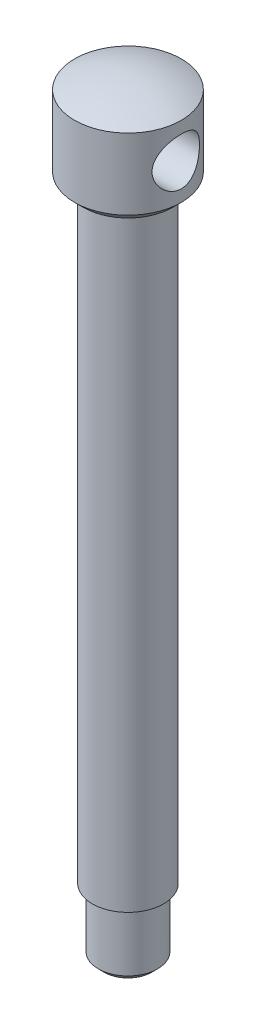
ISO-10303-21;
HEADER;
FILE_DESCRIPTION(('STEP AP214'),'2;1');
FILE_NAME('part.step','',(''),(''),'','','');
FILE_SCHEMA(('AUTOMOTIVE_DESIGN { 1 0 10303 214 1 1 1 1 }'));
ENDSEC;
DATA;
#1=APPLICATION_CONTEXT('core data for automotive mechanical design processes');
#2=APPLICATION_PROTOCOL_DEFINITION('international standard','automotive_design',2000,#1);
#3=PRODUCT_CONTEXT('',#1,'mechanical');
#4=PRODUCT('Part','Part','',(#3));
#5=PRODUCT_RELATED_PRODUCT_CATEGORY('part','',(#4));
#6=PRODUCT_DEFINITION_FORMATION('','',#4);
#7=PRODUCT_DEFINITION_CONTEXT('part definition',#1,'design');
#8=PRODUCT_DEFINITION('design','',#6,#7);
#9=PRODUCT_DEFINITION_SHAPE('','',#8);
#10=(LENGTH_UNIT() NAMED_UNIT(*) SI_UNIT(.MILLI.,.METRE.));
#11=(NAMED_UNIT(*) PLANE_ANGLE_UNIT() SI_UNIT($,.RADIAN.));
#12=(NAMED_UNIT(*) SI_UNIT($,.STERADIAN.) SOLID_ANGLE_UNIT());
#13=UNCERTAINTY_MEASURE_WITH_UNIT(LENGTH_MEASURE(1.E-05),#10,'distance_accuracy_value','');
#14=(GEOMETRIC_REPRESENTATION_CONTEXT(3) GLOBAL_UNCERTAINTY_ASSIGNED_CONTEXT((#13)) GLOBAL_UNIT_ASSIGNED_CONTEXT((#10,
#11,#12)) REPRESENTATION_CONTEXT('',''));
#15=CARTESIAN_POINT('',(0.,0.,0.));
#16=DIRECTION('',(0.,0.,1.));
#17=DIRECTION('',(1.,0.,0.));
#18=AXIS2_PLACEMENT_3D('',#15,#16,#17);
#19=CARTESIAN_POINT('',(0.,24.,0.));
#20=DIRECTION('',(0.,-1.,0.));
#21=DIRECTION('',(0.,0.,-1.));
#22=AXIS2_PLACEMENT_3D('',#19,#20,#21);
#23=CYLINDRICAL_SURFACE('',#22,18.);
#24=CARTESIAN_POINT('',(0.,24.,0.));
#25=DIRECTION('',(0.,1.,0.));
#26=DIRECTION('',(0.,0.,1.));
#27=AXIS2_PLACEMENT_3D('',#24,#25,#26);
#28=CIRCLE('',#27,18.);
#29=CARTESIAN_POINT('',(0.,24.,18.));
#30=VERTEX_POINT('',#29);
#31=EDGE_CURVE('E53',#30,#30,#28,.T.);
#32=ORIENTED_EDGE('',*,*,#31,.F.);
#33=EDGE_LOOP('',(#32));
#34=FACE_BOUND('',#33,.T.);
#35=CARTESIAN_POINT('',(0.,0.,0.));
#36=DIRECTION('',(0.,1.,0.));
#37=DIRECTION('',(0.,0.,1.));
#38=AXIS2_PLACEMENT_3D('',#35,#36,#37);
#39=CIRCLE('',#38,18.);
#40=CARTESIAN_POINT('',(0.,0.,18.));
#41=VERTEX_POINT('',#40);
#42=EDGE_CURVE('E84',#41,#41,#39,.T.);
#43=ORIENTED_EDGE('',*,*,#42,.T.);
#44=EDGE_LOOP('',(#43));
#45=FACE_BOUND('',#44,.T.);
#46=CARTESIAN_POINT('',(-16.1245154965971,12.,8.));
#47=CARTESIAN_POINT('',(-16.1245173844685,12.2119145699032,7.99999831723584));
#48=CARTESIAN_POINT('',(-16.1287075710206,12.4238870824603,7.99156779414506));
#49=CARTESIAN_POINT('',(-16.1453266061845,12.8462633434164,7.95793746262861));
#50=CARTESIAN_POINT('',(-16.1577603573088,13.0566660829166,7.93272767540808));
#51=CARTESIAN_POINT('',(-16.1904617266022,13.4746324276211,7.86576997483584));
#52=CARTESIAN_POINT('',(-16.2107447194581,13.6821896277852,7.82398959985824));
#53=CARTESIAN_POINT('',(-16.2584620085057,14.0926462027807,7.72434196550041));
#54=CARTESIAN_POINT('',(-16.2858993425086,14.2955435590751,7.66646787185647));
#55=CARTESIAN_POINT('',(-16.3468833814742,14.6942970350349,7.53555475293443));
#56=CARTESIAN_POINT('',(-16.3803993264153,14.8901829160202,7.46259183317014));
#57=CARTESIAN_POINT('',(-16.4526380017907,15.2749075296295,7.30194878977129));
#58=CARTESIAN_POINT('',(-16.491362725522,15.4637435288845,7.21426302879007));
#59=CARTESIAN_POINT('',(-16.5728994701461,15.833203404339,7.02492815140359));
#60=CARTESIAN_POINT('',(-16.6157090671748,16.01383205779,6.92328730008513));
#61=CARTESIAN_POINT('',(-16.7043290743674,16.3662002668038,6.70664513728595));
#62=CARTESIAN_POINT('',(-16.7501405774116,16.5379365437966,6.59163894807261));
#63=CARTESIAN_POINT('',(-16.8466296186917,16.882417707415,6.34115277263391));
#64=CARTESIAN_POINT('',(-16.8974306119768,17.0545169166474,6.20483168139261));
#65=CARTESIAN_POINT('',(-16.9997880262405,17.3868159200026,5.91864012310987));
#66=CARTESIAN_POINT('',(-17.0513444742763,17.5470152866687,5.76876916976921));
#67=CARTESIAN_POINT('',(-17.1539222783134,17.8547509634068,5.45619080306819));
#68=CARTESIAN_POINT('',(-17.2049433056521,18.0022798541583,5.2934759744243));
#69=CARTESIAN_POINT('',(-17.3051194894044,18.2836647216014,4.9561857705587));
#70=CARTESIAN_POINT('',(-17.3542752786211,18.4175253619383,4.78161447487838));
#71=CARTESIAN_POINT('',(-17.451944420544,18.6772432950865,4.4122508569734));
#72=CARTESIAN_POINT('',(-17.5002965309104,18.8023418576139,4.21688105837181));
#73=CARTESIAN_POINT('',(-17.592223783187,19.0354680122102,3.81524307030924));
#74=CARTESIAN_POINT('',(-17.6358009081066,19.1435026990481,3.60897945809888));
#75=CARTESIAN_POINT('',(-17.7169432898632,19.3415420816456,3.18686322089285));
#76=CARTESIAN_POINT('',(-17.7545095070744,19.4315496582107,2.97101213476107));
#77=CARTESIAN_POINT('',(-17.8225194812956,19.5925972938844,2.53126088316878));
#78=CARTESIAN_POINT('',(-17.852963815067,19.6636388890074,2.30736137120063));
#79=CARTESIAN_POINT('',(-17.904257876405,19.782361040496,1.86651849716053));
#80=CARTESIAN_POINT('',(-17.9255631028507,19.8311611107898,1.6499293680169));
#81=CARTESIAN_POINT('',(-17.9604311199582,19.9106488664382,1.21283479296799));
#82=CARTESIAN_POINT('',(-17.9739941859878,19.9413371959804,0.992329486638333));
#83=CARTESIAN_POINT('',(-17.9929834790412,19.9842234642036,0.549266332095985));
#84=CARTESIAN_POINT('',(-17.9984129168231,19.9964286991262,0.326709328719163));
#85=CARTESIAN_POINT('',(-18.000986079252,20.0022189961761,-0.118690285937499));
#86=CARTESIAN_POINT('',(-17.9981301795248,19.9958049024332,-0.341532883811738));
#87=CARTESIAN_POINT('',(-17.9847020933519,19.9655302708869,-0.770229836855619));
#88=CARTESIAN_POINT('',(-17.9746788214889,19.9429106160868,-0.976190488290877));
#89=CARTESIAN_POINT('',(-17.9477796781798,19.8818492449923,-1.38537156736781));
#90=CARTESIAN_POINT('',(-17.9309014453193,19.8434020763335,-1.58859102576598));
#91=CARTESIAN_POINT('',(-17.8907148831089,19.7510904248939,-1.99076696624121));
#92=CARTESIAN_POINT('',(-17.8674087504012,19.6972312087224,-2.18972487965375));
#93=CARTESIAN_POINT('',(-17.814913874302,19.574577717923,-2.58226130183553));
#94=CARTESIAN_POINT('',(-17.7857228880376,19.5057777482051,-2.77583772747246));
#95=CARTESIAN_POINT('',(-17.7216726940735,19.3527262826544,-3.15921637846952));
#96=CARTESIAN_POINT('',(-17.6867358849264,19.2682608788418,-3.34892013533131));
#97=CARTESIAN_POINT('',(-17.612310171007,19.0852283296333,-3.72054572501928));
#98=CARTESIAN_POINT('',(-17.5728196098477,18.9866560498229,-3.90246469299827));
#99=CARTESIAN_POINT('',(-17.4901925625269,18.7761497176617,-4.25750941286914));
#100=CARTESIAN_POINT('',(-17.447056279086,18.6642164081091,-4.43063565282522));
#101=CARTESIAN_POINT('',(-17.3580761944569,18.4276607109613,-4.76733985854246));
#102=CARTESIAN_POINT('',(-17.3122314231476,18.3030337650693,-4.93091436085488));
#103=CARTESIAN_POINT('',(-17.2151845254857,18.0315737962729,-5.26014620577745));
#104=CARTESIAN_POINT('',(-17.1638442956857,17.8837656621301,-5.4249598087832));
#105=CARTESIAN_POINT('',(-17.0605056347139,17.575122947009,-5.74168121901704));
#106=CARTESIAN_POINT('',(-17.0085071780705,17.4142878606156,-5.89358852504236));
#107=CARTESIAN_POINT('',(-16.9051693940131,17.0803516529326,-6.18376803613575));
#108=CARTESIAN_POINT('',(-16.8538305336574,16.9072423508915,-6.32203099763521));
#109=CARTESIAN_POINT('',(-16.753252225237,16.5498191149581,-6.58393616631743));
#110=CARTESIAN_POINT('',(-16.7040120270665,16.3655092425015,-6.70758362588862));
#111=CARTESIAN_POINT('',(-16.6070020506593,15.9785735644356,-6.94438947774858));
#112=CARTESIAN_POINT('',(-16.5593822210479,15.7755029510885,-7.05688426159653));
#113=CARTESIAN_POINT('',(-16.4695129333972,15.3594753344981,-7.26415218409369));
#114=CARTESIAN_POINT('',(-16.4272611000893,15.1465227612432,-7.3589331696747));
#115=CARTESIAN_POINT('',(-16.3496213055803,14.7121477583196,-7.52985387823975));
#116=CARTESIAN_POINT('',(-16.3142303541259,14.4907290691367,-7.60600172612036));
#117=CARTESIAN_POINT('',(-16.2516495386502,14.0409961199143,-7.73881716542491));
#118=CARTESIAN_POINT('',(-16.2244588203143,13.8126825809209,-7.79548678621097));
#119=CARTESIAN_POINT('',(-16.1809822825699,13.3673921967089,-7.88531040967217));
#120=CARTESIAN_POINT('',(-16.1640613735819,13.1507551466112,-7.91984376057651));
#121=CARTESIAN_POINT('',(-16.1388886731971,12.7148765749734,-7.97101582222543));
#122=CARTESIAN_POINT('',(-16.130636464286,12.4956351793819,-7.98765539479638));
#123=CARTESIAN_POINT('',(-16.1231199685624,12.0564554242867,-8.00281664233786));
#124=CARTESIAN_POINT('',(-16.1238523193879,11.8365173563091,-8.00134509517347));
#125=CARTESIAN_POINT('',(-16.134268851521,11.3977271592388,-7.98031997885346));
#126=CARTESIAN_POINT('',(-16.1439526799922,11.1788749876856,-7.96076712240067));
#127=CARTESIAN_POINT('',(-16.1708129564299,10.7609413125311,-7.90605141179141));
#128=CARTESIAN_POINT('',(-16.1873501344573,10.5616427376195,-7.87221665979632));
#129=CARTESIAN_POINT('',(-16.2272043533718,10.1667609179082,-7.78973268777251));
#130=CARTESIAN_POINT('',(-16.2505237032065,9.97117896260591,-7.74107842226681));
#131=CARTESIAN_POINT('',(-16.3032361956667,9.58502946303924,-7.62943609248794));
#132=CARTESIAN_POINT('',(-16.3326282043979,9.39446099012929,-7.56645070391758));
#133=CARTESIAN_POINT('',(-16.396652000303,9.01932537614815,-7.42668830283406));
#134=CARTESIAN_POINT('',(-16.4312858447315,8.83476062605354,-7.34990587319376));
#135=CARTESIAN_POINT('',(-16.5449440183094,8.27548917084069,-7.09233057162595));
#136=CARTESIAN_POINT('',(-16.6312839817267,7.91227349797858,-6.88923170163483));
#137=CARTESIAN_POINT('',(-16.8138795280454,7.22324893180042,-6.43071715646188));
#138=CARTESIAN_POINT('',(-16.9101397650623,6.89745774921686,-6.17527686915352));
#139=CARTESIAN_POINT('',(-17.0597302595375,6.42691182824524,-5.74384979288593));
#140=CARTESIAN_POINT('',(-17.1128010645076,6.2668825004083,-5.58412874072951));
#141=CARTESIAN_POINT('',(-17.2177753192135,5.96075686812445,-5.25153114631175));
#142=CARTESIAN_POINT('',(-17.2696791438604,5.81465603860062,-5.07865890963662));
#143=CARTESIAN_POINT('',(-17.3709727481302,5.53723092057165,-4.72058782341959));
#144=CARTESIAN_POINT('',(-17.4203610743079,5.40591512292914,-4.53538198701895));
#145=CARTESIAN_POINT('',(-17.5152557653374,5.15915562653861,-4.15384559946254));
#146=CARTESIAN_POINT('',(-17.5607638077543,5.04370505542867,-3.95751991748039));
#147=CARTESIAN_POINT('',(-17.6470640049451,4.82862209606487,-3.55306354214972));
#148=CARTESIAN_POINT('',(-17.6878108023972,4.72913892683237,-3.34484366457995));
#149=CARTESIAN_POINT('',(-17.7629557505932,4.54819659982386,-2.91959172938723));
#150=CARTESIAN_POINT('',(-17.7973537914545,4.46673775400314,-2.7025595193221));
#151=CARTESIAN_POINT('',(-17.8587679278129,4.32277191975555,-2.26140906177526));
#152=CARTESIAN_POINT('',(-17.8857881728829,4.2602542758474,-2.03729487695818));
#153=CARTESIAN_POINT('',(-17.9316455780454,4.1548632895351,-1.58367729933312));
#154=CARTESIAN_POINT('',(-17.9504834603661,4.11198821333248,-1.354174384055));
#155=CARTESIAN_POINT('',(-17.9782671297193,4.04897376655184,-0.909716399150556));
#156=CARTESIAN_POINT('',(-17.9878671551004,4.02732817564721,-0.695014576236323));
#157=CARTESIAN_POINT('',(-17.9993471860939,4.00146034748862,-0.264362285110343));
#158=CARTESIAN_POINT('',(-18.0012276120922,3.99723716146344,-0.0484118855336484));
#159=CARTESIAN_POINT('',(-17.997217448135,4.00626176004555,0.383006037482065));
#160=CARTESIAN_POINT('',(-17.9913283745967,4.0195061354099,0.59847364692893));
#161=CARTESIAN_POINT('',(-17.971942933447,4.06330557092701,1.02729288739305));
#162=CARTESIAN_POINT('',(-17.9584466541185,4.09386043018835,1.24064454293712));
#163=CARTESIAN_POINT('',(-17.9249777004703,4.17018880765659,1.65416895049555));
#164=CARTESIAN_POINT('',(-17.9053211453748,4.21522180045514,1.85450476600019));
#165=CARTESIAN_POINT('',(-17.8598656381032,4.32034850891315,2.25054265745567));
#166=CARTESIAN_POINT('',(-17.8340645509163,4.38044745985083,2.44624309673059));
#167=CARTESIAN_POINT('',(-17.7769360415322,4.51513718601026,2.83169559318192));
#168=CARTESIAN_POINT('',(-17.7456100149699,4.58972430191025,3.02144913835909));
#169=CARTESIAN_POINT('',(-17.678127350379,4.75281449472967,3.39406573427307));
#170=CARTESIAN_POINT('',(-17.6419688702804,4.84132288054765,3.57692612317894));
#171=CARTESIAN_POINT('',(-17.5638914957692,5.03590756725889,3.94287872867609));
#172=CARTESIAN_POINT('',(-17.5217854585831,5.14259959262605,4.12560358359436));
#173=CARTESIAN_POINT('',(-17.4341502103175,5.36972312448721,4.48151913664302));
#174=CARTESIAN_POINT('',(-17.3886198254664,5.49015934949821,4.6547065300352));
#175=CARTESIAN_POINT('',(-17.2951906704745,5.74399909977319,4.99067005689803));
#176=CARTESIAN_POINT('',(-17.2472914674081,5.87740499971223,5.15344427469433));
#177=CARTESIAN_POINT('',(-17.1502306027945,6.1564124607654,5.46778331119966));
#178=CARTESIAN_POINT('',(-17.1010688746332,6.30201466630886,5.61934753679651));
#179=CARTESIAN_POINT('',(-16.9987278379694,6.61663778858496,5.92205669373057));
#180=CARTESIAN_POINT('',(-16.9455381412313,6.78660009988145,6.07222140456486));
#181=CARTESIAN_POINT('',(-16.8405029326141,7.1388492179371,6.35771940607388));
#182=CARTESIAN_POINT('',(-16.7886570027711,7.3211321272898,6.49305735176128));
#183=CARTESIAN_POINT('',(-16.6877339704444,7.69728935827532,6.74821326098058));
#184=CARTESIAN_POINT('',(-16.63865988301,7.89117584697097,6.86801450136303));
#185=CARTESIAN_POINT('',(-16.5448700115573,8.28919140732939,7.09097341812934));
#186=CARTESIAN_POINT('',(-16.5001522654361,8.4933158044783,7.19413860126822));
#187=CARTESIAN_POINT('',(-16.4163378623127,8.91158578597332,7.38340158764196));
#188=CARTESIAN_POINT('',(-16.3772670113222,9.12577179511081,7.46942167707747));
#189=CARTESIAN_POINT('',(-16.3064029483656,9.56176342387312,7.62288490526618));
#190=CARTESIAN_POINT('',(-16.2746060925309,9.78356516410991,7.69033734883932));
#191=CARTESIAN_POINT('',(-16.219563234548,10.2325873729558,7.80575763461412));
#192=CARTESIAN_POINT('',(-16.1962948027815,10.4597919297211,7.85377662169272));
#193=CARTESIAN_POINT('',(-16.1591558445265,10.9181503540471,7.92991158533124));
#194=CARTESIAN_POINT('',(-16.1452782569039,11.1493011200017,7.95804251676984));
#195=CARTESIAN_POINT('',(-16.132434322231,11.4842084955691,7.98402286016531));
#196=CARTESIAN_POINT('',(-16.1294677679271,11.5872461230906,7.99001178153472));
#197=CARTESIAN_POINT('',(-16.1255078681798,11.7935179120941,7.99800081602834));
#198=CARTESIAN_POINT('',(-16.1245145767981,11.896752078883,8.00000081986765));
#199=CARTESIAN_POINT('',(-16.1245154965971,12.,8.));
#200=B_SPLINE_CURVE_WITH_KNOTS('',3,(#46,#47,#48,#49,#50,#51,#52,#53,#54,#55,#56,#57,#58,#59,
#60,#61,#62,#63,#64,#65,#66,#67,#68,#69,#70,#71,#72,#73,#74,#75,#76,#77,#78,#79,#80,#81,#82,#83,
#84,#85,#86,#87,#88,#89,#90,#91,#92,#93,#94,#95,#96,#97,#98,#99,#100,#101,#102,#103,#104,#105,
#106,#107,#108,#109,#110,#111,#112,#113,#114,#115,#116,#117,#118,#119,#120,#121,#122,#123,#124,
#125,#126,#127,#128,#129,#130,#131,#132,#133,#134,#135,#136,#137,#138,#139,#140,#141,#142,#143,
#144,#145,#146,#147,#148,#149,#150,#151,#152,#153,#154,#155,#156,#157,#158,#159,#160,#161,#162,
#163,#164,#165,#166,#167,#168,#169,#170,#171,#172,#173,#174,#175,#176,#177,#178,#179,#180,#181,
#182,#183,#184,#185,#186,#187,#188,#189,#190,#191,#192,#193,#194,#195,#196,#197,#198,#199),
.UNSPECIFIED.,.T.,.F.,(4,2,2,2,2,2,2,2,2,2,2,2,2,2,2,2,2,2,2,2,2,2,2,2,2,2,2,2,2,2,2,2,2,2,2,2,
2,2,2,2,2,2,2,2,2,2,2,2,2,2,2,2,2,2,2,2,2,2,2,2,2,2,2,2,2,2,2,2,2,2,2,2,2,2,2,2,4),(0.,
0.635636786928929,1.27165193153098,1.90891922718068,2.54645755535102,3.18085542165324,
3.8154967539086,4.44976381995587,5.08426309551977,5.75957539492706,6.43491194065524,
7.1106412777736,7.78613927824711,8.49616211017143,9.20588894929659,9.91550228053243,
10.6250581242452,11.2932925940023,11.9615032949632,12.6294501494797,13.2973667222889,
13.9189587631528,14.5407651134849,15.1623592331946,15.7841907082495,16.4152389805999,
17.0465175195699,17.6777609793301,18.3092319238108,18.9902534133529,19.6713013375874,
20.3528075255057,21.0340680503805,21.7441029457321,22.4538225574607,23.1632321454316,
23.8725678003063,24.5317508363103,25.1909021223531,25.8498067365912,26.5086853801897,
27.1164695431674,27.7244608651212,28.332338764623,28.9404558585894,30.2098823122136,
31.4799070545452,32.1759540258526,32.8717740899456,33.5679917384279,34.2639068482617,
34.9659880424643,35.6680813869599,36.3697790283171,37.0714147207057,37.718598553561,
38.3657471422866,39.0127694420453,39.6597842331429,40.2779063013466,40.8962434595929,
41.514424645059,42.1328421490507,42.7793728810372,43.4261262448349,44.0729982493803,
44.7199044549849,45.4179476734237,46.1157711022534,46.8143395168877,47.5125918262566,
48.2139405270058,48.9149371177799,49.6140766404868,50.3126898825115,50.6223730671826,
50.9320647361692),.UNSPECIFIED.);
#201=CARTESIAN_POINT('',(-16.1245154965971,12.,8.));
#202=VERTEX_POINT('',#201);
#203=EDGE_CURVE('E87',#202,#202,#200,.T.);
#204=ORIENTED_EDGE('',*,*,#203,.F.);
#205=EDGE_LOOP('',(#204));
#206=FACE_BOUND('',#205,.T.);
#207=CARTESIAN_POINT('',(16.1245154965971,12.,8.));
#208=CARTESIAN_POINT('',(16.1245173844685,11.7880854300968,7.99999831723584));
#209=CARTESIAN_POINT('',(16.1287075710206,11.5761129175398,7.99156779414506));
#210=CARTESIAN_POINT('',(16.1453266061845,11.1537366565836,7.95793746262861));
#211=CARTESIAN_POINT('',(16.1577603573088,10.9433339170834,7.93272767540808));
#212=CARTESIAN_POINT('',(16.1904617266022,10.5253675723789,7.86576997483584));
#213=CARTESIAN_POINT('',(16.2107447194581,10.3178103722148,7.82398959985824));
#214=CARTESIAN_POINT('',(16.2584620085057,9.90735379721933,7.72434196550041));
#215=CARTESIAN_POINT('',(16.2858993425086,9.70445644092491,7.66646787185647));
#216=CARTESIAN_POINT('',(16.3468833814742,9.3057029649651,7.53555475293443));
#217=CARTESIAN_POINT('',(16.3803993264153,9.10981708397977,7.46259183317014));
#218=CARTESIAN_POINT('',(16.4526380017907,8.72509247037046,7.30194878977129));
#219=CARTESIAN_POINT('',(16.491362725522,8.53625647111554,7.21426302879007));
#220=CARTESIAN_POINT('',(16.5728994701461,8.16679659566098,7.02492815140359));
#221=CARTESIAN_POINT('',(16.6157090671748,7.98616794221004,6.92328730008513));
#222=CARTESIAN_POINT('',(16.7043290743674,7.63379973319621,6.70664513728595));
#223=CARTESIAN_POINT('',(16.7501405774116,7.46206345620336,6.59163894807261));
#224=CARTESIAN_POINT('',(16.8466296186917,7.11758229258499,6.34115277263391));
#225=CARTESIAN_POINT('',(16.8974306119768,6.94548308335264,6.20483168139261));
#226=CARTESIAN_POINT('',(16.9997880262405,6.61318407999737,5.91864012310987));
#227=CARTESIAN_POINT('',(17.0513444742763,6.45298471333128,5.7687691697692));
#228=CARTESIAN_POINT('',(17.1539222783134,6.14524903659325,5.45619080306819));
#229=CARTESIAN_POINT('',(17.2049433056521,5.99772014584169,5.2934759744243));
#230=CARTESIAN_POINT('',(17.3051194894044,5.71633527839862,4.9561857705587));
#231=CARTESIAN_POINT('',(17.3542752786211,5.58247463806171,4.78161447487838));
#232=CARTESIAN_POINT('',(17.451944420544,5.32275670491353,4.4122508569734));
#233=CARTESIAN_POINT('',(17.5002965309104,5.19765814238606,4.21688105837181));
#234=CARTESIAN_POINT('',(17.592223783187,4.9645319877898,3.81524307030923));
#235=CARTESIAN_POINT('',(17.6358009081066,4.85649730095189,3.60897945809888));
#236=CARTESIAN_POINT('',(17.7169432898632,4.6584579183544,3.18686322089284));
#237=CARTESIAN_POINT('',(17.7545095070744,4.56845034178927,2.97101213476107));
#238=CARTESIAN_POINT('',(17.8225194812956,4.40740270611563,2.53126088316878));
#239=CARTESIAN_POINT('',(17.852963815067,4.33636111099256,2.30736137120062));
#240=CARTESIAN_POINT('',(17.904257876405,4.21763895950403,1.86651849716053));
#241=CARTESIAN_POINT('',(17.9255631028507,4.16883888921021,1.6499293680169));
#242=CARTESIAN_POINT('',(17.9604311199582,4.08935113356176,1.21283479296799));
#243=CARTESIAN_POINT('',(17.9739941859878,4.05866280401959,0.992329486638333));
#244=CARTESIAN_POINT('',(17.9929834790412,4.01577653579641,0.549266332095984));
#245=CARTESIAN_POINT('',(17.9984129168231,4.00357130087376,0.326709328719163));
#246=CARTESIAN_POINT('',(18.000986079252,3.99778100382386,-0.118690285937499));
#247=CARTESIAN_POINT('',(17.9981301795248,4.00419509756678,-0.341532883811738));
#248=CARTESIAN_POINT('',(17.9847020933519,4.03446972911309,-0.77022983685562));
#249=CARTESIAN_POINT('',(17.9746788214889,4.05708938391318,-0.976190488290878));
#250=CARTESIAN_POINT('',(17.9477796781798,4.11815075500771,-1.38537156736781));
#251=CARTESIAN_POINT('',(17.9309014453193,4.15659792366646,-1.58859102576598));
#252=CARTESIAN_POINT('',(17.8907148831089,4.24890957510613,-1.99076696624121));
#253=CARTESIAN_POINT('',(17.8674087504012,4.30276879127764,-2.18972487965375));
#254=CARTESIAN_POINT('',(17.814913874302,4.42542228207703,-2.58226130183553));
#255=CARTESIAN_POINT('',(17.7857228880376,4.49422225179495,-2.77583772747246));
#256=CARTESIAN_POINT('',(17.7216726940735,4.64727371734559,-3.15921637846952));
#257=CARTESIAN_POINT('',(17.6867358849264,4.73173912115816,-3.34892013533131));
#258=CARTESIAN_POINT('',(17.612310171007,4.91477167036674,-3.72054572501928));
#259=CARTESIAN_POINT('',(17.5728196098477,5.01334395017711,-3.90246469299827));
#260=CARTESIAN_POINT('',(17.4901925625269,5.2238502823383,-4.25750941286914));
#261=CARTESIAN_POINT('',(17.447056279086,5.3357835918909,-4.43063565282522));
#262=CARTESIAN_POINT('',(17.3580761944569,5.57233928903866,-4.76733985854246));
#263=CARTESIAN_POINT('',(17.3122314231476,5.69696623493067,-4.93091436085488));
#264=CARTESIAN_POINT('',(17.2151845254857,5.96842620372712,-5.26014620577745));
#265=CARTESIAN_POINT('',(17.1638442956857,6.11623433786988,-5.4249598087832));
#266=CARTESIAN_POINT('',(17.0605056347139,6.42487705299103,-5.74168121901704));
#267=CARTESIAN_POINT('',(17.0085071780705,6.58571213938436,-5.89358852504236));
#268=CARTESIAN_POINT('',(16.9051693940131,6.91964834706736,-6.18376803613575));
#269=CARTESIAN_POINT('',(16.8538305336574,7.09275764910846,-6.32203099763522));
#270=CARTESIAN_POINT('',(16.753252225237,7.45018088504188,-6.58393616631743));
#271=CARTESIAN_POINT('',(16.7040120270665,7.63449075749853,-6.70758362588862));
#272=CARTESIAN_POINT('',(16.6070020506593,8.02142643556438,-6.94438947774858));
#273=CARTESIAN_POINT('',(16.5593822210479,8.22449704891148,-7.05688426159653));
#274=CARTESIAN_POINT('',(16.4695129333972,8.64052466550193,-7.26415218409368));
#275=CARTESIAN_POINT('',(16.4272611000893,8.85347723875682,-7.3589331696747));
#276=CARTESIAN_POINT('',(16.3496213055803,9.28785224168041,-7.52985387823975));
#277=CARTESIAN_POINT('',(16.3142303541259,9.50927093086334,-7.60600172612036));
#278=CARTESIAN_POINT('',(16.2516495386502,9.95900388008569,-7.73881716542491));
#279=CARTESIAN_POINT('',(16.2244588203143,10.1873174190791,-7.79548678621097));
#280=CARTESIAN_POINT('',(16.1809822825699,10.6326078032911,-7.88531040967217));
#281=CARTESIAN_POINT('',(16.1640613735819,10.8492448533888,-7.91984376057651));
#282=CARTESIAN_POINT('',(16.1388886731971,11.2851234250266,-7.97101582222543));
#283=CARTESIAN_POINT('',(16.130636464286,11.5043648206182,-7.98765539479638));
#284=CARTESIAN_POINT('',(16.1231199685624,11.9435445757133,-8.00281664233786));
#285=CARTESIAN_POINT('',(16.1238523193879,12.1634826436909,-8.00134509517347));
#286=CARTESIAN_POINT('',(16.134268851521,12.6022728407612,-7.98031997885346));
#287=CARTESIAN_POINT('',(16.1439526799922,12.8211250123144,-7.96076712240067));
#288=CARTESIAN_POINT('',(16.1708129564299,13.2390586874689,-7.90605141179141));
#289=CARTESIAN_POINT('',(16.1873501344573,13.4383572623805,-7.87221665979632));
#290=CARTESIAN_POINT('',(16.2272043533718,13.8332390820918,-7.78973268777251));
#291=CARTESIAN_POINT('',(16.2505237032065,14.0288210373941,-7.74107842226681));
#292=CARTESIAN_POINT('',(16.3032361956667,14.4149705369608,-7.62943609248794));
#293=CARTESIAN_POINT('',(16.3326282043979,14.6055390098707,-7.56645070391758));
#294=CARTESIAN_POINT('',(16.396652000303,14.9806746238518,-7.42668830283406));
#295=CARTESIAN_POINT('',(16.4312858447315,15.1652393739465,-7.34990587319376));
#296=CARTESIAN_POINT('',(16.5449440183094,15.7245108291593,-7.09233057162595));
#297=CARTESIAN_POINT('',(16.6312839817267,16.0877265020214,-6.88923170163483));
#298=CARTESIAN_POINT('',(16.8138795280454,16.7767510681996,-6.43071715646188));
#299=CARTESIAN_POINT('',(16.9101397650623,17.1025422507831,-6.17527686915352));
#300=CARTESIAN_POINT('',(17.0597302595375,17.5730881717548,-5.74384979288593));
#301=CARTESIAN_POINT('',(17.1128010645076,17.7331174995917,-5.58412874072952));
#302=CARTESIAN_POINT('',(17.2177753192135,18.0392431318755,-5.25153114631175));
#303=CARTESIAN_POINT('',(17.2696791438604,18.1853439613994,-5.07865890963662));
#304=CARTESIAN_POINT('',(17.3709727481302,18.4627690794284,-4.72058782341959));
#305=CARTESIAN_POINT('',(17.4203610743079,18.5940848770709,-4.53538198701895));
#306=CARTESIAN_POINT('',(17.5152557653374,18.8408443734614,-4.15384559946254));
#307=CARTESIAN_POINT('',(17.5607638077543,18.9562949445713,-3.95751991748039));
#308=CARTESIAN_POINT('',(17.6470640049451,19.1713779039351,-3.55306354214972));
#309=CARTESIAN_POINT('',(17.6878108023972,19.2708610731676,-3.34484366457995));
#310=CARTESIAN_POINT('',(17.7629557505932,19.4518034001761,-2.91959172938723));
#311=CARTESIAN_POINT('',(17.7973537914545,19.5332622459969,-2.7025595193221));
#312=CARTESIAN_POINT('',(17.8587679278129,19.6772280802444,-2.26140906177526));
#313=CARTESIAN_POINT('',(17.8857881728829,19.7397457241526,-2.03729487695818));
#314=CARTESIAN_POINT('',(17.9316455780454,19.8451367104649,-1.58367729933312));
#315=CARTESIAN_POINT('',(17.9504834603661,19.8880117866675,-1.35417438405501));
#316=CARTESIAN_POINT('',(17.9782671297193,19.9510262334482,-0.909716399150556));
#317=CARTESIAN_POINT('',(17.9878671551004,19.9726718243528,-0.695014576236324));
#318=CARTESIAN_POINT('',(17.9993471860939,19.9985396525114,-0.264362285110344));
#319=CARTESIAN_POINT('',(18.0012276120922,20.0027628385366,-0.0484118855336497));
#320=CARTESIAN_POINT('',(17.997217448135,19.9937382399545,0.383006037482065));
#321=CARTESIAN_POINT('',(17.9913283745967,19.9804938645901,0.598473646928931));
#322=CARTESIAN_POINT('',(17.971942933447,19.936694429073,1.02729288739305));
#323=CARTESIAN_POINT('',(17.9584466541185,19.9061395698117,1.24064454293712));
#324=CARTESIAN_POINT('',(17.9249777004703,19.8298111923434,1.65416895049554));
#325=CARTESIAN_POINT('',(17.9053211453748,19.7847781995449,1.85450476600019));
#326=CARTESIAN_POINT('',(17.8598656381032,19.6796514910869,2.25054265745567));
#327=CARTESIAN_POINT('',(17.8340645509163,19.6195525401492,2.44624309673059));
#328=CARTESIAN_POINT('',(17.7769360415322,19.4848628139897,2.83169559318191));
#329=CARTESIAN_POINT('',(17.7456100149699,19.4102756980898,3.02144913835908));
#330=CARTESIAN_POINT('',(17.678127350379,19.2471855052703,3.39406573427306));
#331=CARTESIAN_POINT('',(17.6419688702804,19.1586771194523,3.57692612317894));
#332=CARTESIAN_POINT('',(17.5638914957692,18.9640924327411,3.94287872867608));
#333=CARTESIAN_POINT('',(17.5217854585831,18.857400407374,4.12560358359436));
#334=CARTESIAN_POINT('',(17.4341502103175,18.6302768755128,4.48151913664302));
#335=CARTESIAN_POINT('',(17.3886198254664,18.5098406505018,4.65470653003519));
#336=CARTESIAN_POINT('',(17.2951906704745,18.2560009002268,4.99067005689802));
#337=CARTESIAN_POINT('',(17.2472914674081,18.1225950002878,5.15344427469432));
#338=CARTESIAN_POINT('',(17.1502306027945,17.8435875392346,5.46778331119965));
#339=CARTESIAN_POINT('',(17.1010688746332,17.6979853336911,5.6193475367965));
#340=CARTESIAN_POINT('',(16.9987278379694,17.383362211415,5.92205669373057));
#341=CARTESIAN_POINT('',(16.9455381412313,17.2133999001185,6.07222140456486));
#342=CARTESIAN_POINT('',(16.8405029326141,16.8611507820629,6.35771940607388));
#343=CARTESIAN_POINT('',(16.7886570027711,16.6788678727102,6.49305735176128));
#344=CARTESIAN_POINT('',(16.6877339704444,16.3027106417247,6.74821326098058));
#345=CARTESIAN_POINT('',(16.63865988301,16.108824153029,6.86801450136303));
#346=CARTESIAN_POINT('',(16.5448700115573,15.7108085926706,7.09097341812934));
#347=CARTESIAN_POINT('',(16.5001522654361,15.5066841955217,7.19413860126822));
#348=CARTESIAN_POINT('',(16.4163378623127,15.0884142140267,7.38340158764196));
#349=CARTESIAN_POINT('',(16.3772670113222,14.8742282048892,7.46942167707747));
#350=CARTESIAN_POINT('',(16.3064029483656,14.4382365761269,7.62288490526618));
#351=CARTESIAN_POINT('',(16.2746060925309,14.2164348358901,7.69033734883932));
#352=CARTESIAN_POINT('',(16.219563234548,13.7674126270442,7.80575763461412));
#353=CARTESIAN_POINT('',(16.1962948027815,13.5402080702789,7.85377662169272));
#354=CARTESIAN_POINT('',(16.1591558445265,13.0818496459529,7.92991158533124));
#355=CARTESIAN_POINT('',(16.1452782569039,12.8506988799983,7.95804251676984));
#356=CARTESIAN_POINT('',(16.132434322231,12.5157915044309,7.98402286016531));
#357=CARTESIAN_POINT('',(16.1294677679271,12.4127538769094,7.99001178153472));
#358=CARTESIAN_POINT('',(16.1255078681798,12.2064820879059,7.99800081602834));
#359=CARTESIAN_POINT('',(16.1245145767981,12.103247921117,8.00000081986765));
#360=CARTESIAN_POINT('',(16.1245154965971,12.,8.));
#361=B_SPLINE_CURVE_WITH_KNOTS('',3,(#207,#208,#209,#210,#211,#212,#213,#214,#215,#216,#217,
#218,#219,#220,#221,#222,#223,#224,#225,#226,#227,#228,#229,#230,#231,#232,#233,#234,#235,#236,
#237,#238,#239,#240,#241,#242,#243,#244,#245,#246,#247,#248,#249,#250,#251,#252,#253,#254,#255,
#256,#257,#258,#259,#260,#261,#262,#263,#264,#265,#266,#267,#268,#269,#270,#271,#272,#273,#274,
#275,#276,#277,#278,#279,#280,#281,#282,#283,#284,#285,#286,#287,#288,#289,#290,#291,#292,#293,
#294,#295,#296,#297,#298,#299,#300,#301,#302,#303,#304,#305,#306,#307,#308,#309,#310,#311,#312,
#313,#314,#315,#316,#317,#318,#319,#320,#321,#322,#323,#324,#325,#326,#327,#328,#329,#330,#331,
#332,#333,#334,#335,#336,#337,#338,#339,#340,#341,#342,#343,#344,#345,#346,#347,#348,#349,#350,
#351,#352,#353,#354,#355,#356,#357,#358,#359,#360),.UNSPECIFIED.,.T.,.F.,(4,2,2,2,2,2,2,2,2,2,2,
2,2,2,2,2,2,2,2,2,2,2,2,2,2,2,2,2,2,2,2,2,2,2,2,2,2,2,2,2,2,2,2,2,2,2,2,2,2,2,2,2,2,2,2,2,2,2,2,
2,2,2,2,2,2,2,2,2,2,2,2,2,2,2,2,2,4),(0.,0.635636786928929,1.27165193153098,1.90891922718068,
2.54645755535102,3.18085542165324,3.8154967539086,4.44976381995587,5.08426309551977,
5.75957539492706,6.43491194065524,7.1106412777736,7.78613927824711,8.49616211017143,
9.20588894929659,9.91550228053243,10.6250581242452,11.2932925940023,11.9615032949632,
12.6294501494797,13.2973667222889,13.9189587631528,14.5407651134849,15.1623592331946,
15.7841907082495,16.4152389805999,17.0465175195699,17.6777609793301,18.3092319238108,
18.9902534133529,19.6713013375874,20.3528075255057,21.0340680503806,21.7441029457321,
22.4538225574607,23.1632321454316,23.8725678003063,24.5317508363103,25.1909021223531,
25.8498067365912,26.5086853801897,27.1164695431674,27.7244608651212,28.332338764623,
28.9404558585894,30.2098823122136,31.4799070545452,32.1759540258526,32.8717740899456,
33.5679917384279,34.2639068482617,34.9659880424643,35.6680813869599,36.3697790283171,
37.0714147207057,37.718598553561,38.3657471422866,39.0127694420453,39.6597842331429,
40.2779063013466,40.8962434595929,41.5144246450589,42.1328421490507,42.7793728810372,
43.4261262448349,44.0729982493803,44.7199044549849,45.4179476734237,46.1157711022534,
46.8143395168877,47.5125918262566,48.2139405270058,48.9149371177799,49.6140766404867,
50.3126898825115,50.6223730671826,50.9320647361692),.UNSPECIFIED.);
#362=CARTESIAN_POINT('',(16.1245154965971,12.,8.));
#363=VERTEX_POINT('',#362);
#364=EDGE_CURVE('E93',#363,#363,#361,.T.);
#365=ORIENTED_EDGE('',*,*,#364,.F.);
#366=EDGE_LOOP('',(#365));
#367=FACE_BOUND('',#366,.T.);
#368=ADVANCED_FACE('F46',(#34,#45,#206,#367),#23,.T.);
#369=CARTESIAN_POINT('',(0.,-14.5,0.));
#370=DIRECTION('',(0.,0.,1.));
#371=DIRECTION('',(1.,0.,0.));
#372=AXIS2_PLACEMENT_3D('',#369,#370,#371);
#373=SPHERICAL_SURFACE('',#372,42.5);
#374=CARTESIAN_POINT('',(0.,-14.5,0.));
#375=DIRECTION('',(0.,1.,0.));
#376=DIRECTION('',(0.,0.,1.));
#377=AXIS2_PLACEMENT_3D('',#374,#375,#376);
#378=SPHERICAL_SURFACE('',#377,42.5);
#379=ORIENTED_EDGE('',*,*,#31,.T.);
#380=EDGE_LOOP('',(#379));
#381=FACE_BOUND('',#380,.T.);
#382=ADVANCED_FACE('F48',(#381),#378,.T.);
#383=CARTESIAN_POINT('',(24.,12.,0.));
#384=DIRECTION('',(-1.,0.,0.));
#385=DIRECTION('',(0.,0.,1.));
#386=AXIS2_PLACEMENT_3D('',#383,#384,#385);
#387=CYLINDRICAL_SURFACE('',#386,8.);
#388=ORIENTED_EDGE('',*,*,#203,.T.);
#389=EDGE_LOOP('',(#388));
#390=FACE_BOUND('',#389,.T.);
#391=ORIENTED_EDGE('',*,*,#364,.T.);
#392=EDGE_LOOP('',(#391));
#393=FACE_BOUND('',#392,.T.);
#394=ADVANCED_FACE('F98',(#390,#393),#387,.F.);
#395=CARTESIAN_POINT('',(0.,-2.8284271247462,0.));
#396=DIRECTION('',(0.,1.,0.));
#397=DIRECTION('',(0.,0.,1.));
#398=AXIS2_PLACEMENT_3D('',#395,#396,#397);
#399=CONICAL_SURFACE('',#398,15.1715728752538,0.785398163397446);
#400=ORIENTED_EDGE('',*,*,#42,.F.);
#401=EDGE_LOOP('',(#400));
#402=FACE_BOUND('',#401,.T.);
#403=CARTESIAN_POINT('',(0.,-2.8284271247462,0.));
#404=DIRECTION('',(0.,1.,0.));
#405=DIRECTION('',(0.,0.,1.));
#406=AXIS2_PLACEMENT_3D('',#403,#404,#405);
#407=CIRCLE('',#406,15.1715728752538);
#408=CARTESIAN_POINT('',(0.,-2.8284271247462,15.1715728752538));
#409=VERTEX_POINT('',#408);
#410=EDGE_CURVE('E81',#409,#409,#407,.T.);
#411=ORIENTED_EDGE('',*,*,#410,.T.);
#412=EDGE_LOOP('',(#411));
#413=FACE_BOUND('',#412,.T.);
#414=ADVANCED_FACE('F102',(#402,#413),#399,.T.);
#415=CARTESIAN_POINT('',(0.,-2.8284271247462,-15.1715728752538));
#416=DIRECTION('',(0.,1.,0.));
#417=DIRECTION('',(0.,0.,1.));
#418=AXIS2_PLACEMENT_3D('',#415,#416,#417);
#419=PLANE('',#418);
#420=CARTESIAN_POINT('',(0.,-2.82842712474621,0.));
#421=DIRECTION('',(0.,1.,0.));
#422=DIRECTION('',(0.,0.,1.));
#423=AXIS2_PLACEMENT_3D('',#420,#421,#422);
#424=CIRCLE('',#423,12.);
#425=CARTESIAN_POINT('',(0.,-2.82842712474624,12.));
#426=VERTEX_POINT('',#425);
#427=EDGE_CURVE('E80',#426,#426,#424,.T.);
#428=ORIENTED_EDGE('',*,*,#427,.T.);
#429=EDGE_LOOP('',(#428));
#430=FACE_BOUND('',#429,.T.);
#431=ORIENTED_EDGE('',*,*,#410,.F.);
#432=EDGE_LOOP('',(#431));
#433=FACE_BOUND('',#432,.T.);
#434=ADVANCED_FACE('F107',(#430,#433),#419,.F.);
#435=CARTESIAN_POINT('',(0.,-208.,0.));
#436=DIRECTION('',(0.,1.,0.));
#437=DIRECTION('',(0.,0.,1.));
#438=AXIS2_PLACEMENT_3D('',#435,#436,#437);
#439=CYLINDRICAL_SURFACE('',#438,12.);
#440=CARTESIAN_POINT('',(0.,-208.,0.));
#441=DIRECTION('',(0.,1.,0.));
#442=DIRECTION('',(0.,0.,1.));
#443=AXIS2_PLACEMENT_3D('',#440,#441,#442);
#444=CIRCLE('',#443,12.);
#445=CARTESIAN_POINT('',(0.,-208.,12.));
#446=VERTEX_POINT('',#445);
#447=EDGE_CURVE('E77',#446,#446,#444,.T.);
#448=CARTESIAN_POINT('',(0.,-208.,12.));
#449=CARTESIAN_POINT('',(0.,-205.862796115883,12.));
#450=CARTESIAN_POINT('',(0.,-203.725592231766,12.));
#451=CARTESIAN_POINT('',(0.,-199.451184463531,12.));
#452=CARTESIAN_POINT('',(0.,-197.313980579414,12.));
#453=CARTESIAN_POINT('',(0.,-193.039572811179,12.));
#454=CARTESIAN_POINT('',(0.,-190.902368927062,12.));
#455=CARTESIAN_POINT('',(0.,-186.627961158828,12.));
#456=CARTESIAN_POINT('',(0.,-184.490757274711,12.));
#457=CARTESIAN_POINT('',(0.,-180.216349506476,12.));
#458=CARTESIAN_POINT('',(0.,-178.079145622359,12.));
#459=CARTESIAN_POINT('',(0.,-173.804737854124,12.));
#460=CARTESIAN_POINT('',(0.,-171.667533970007,12.));
#461=CARTESIAN_POINT('',(0.,-167.393126201773,12.));
#462=CARTESIAN_POINT('',(0.,-165.255922317655,12.));
#463=CARTESIAN_POINT('',(0.,-160.981514549421,12.));
#464=CARTESIAN_POINT('',(0.,-158.844310665304,12.));
#465=CARTESIAN_POINT('',(0.,-154.569902897069,12.));
#466=CARTESIAN_POINT('',(0.,-152.432699012952,12.));
#467=CARTESIAN_POINT('',(0.,-148.158291244718,12.));
#468=CARTESIAN_POINT('',(0.,-146.0210873606,12.));
#469=CARTESIAN_POINT('',(0.,-141.746679592366,12.));
#470=CARTESIAN_POINT('',(0.,-139.609475708249,12.));
#471=CARTESIAN_POINT('',(0.,-135.335067940014,12.));
#472=CARTESIAN_POINT('',(0.,-133.197864055897,12.));
#473=CARTESIAN_POINT('',(0.,-128.923456287663,12.));
#474=CARTESIAN_POINT('',(0.,-126.786252403545,12.));
#475=CARTESIAN_POINT('',(0.,-122.511844635311,12.));
#476=CARTESIAN_POINT('',(0.,-120.374640751194,12.));
#477=CARTESIAN_POINT('',(0.,-116.100232982959,12.));
#478=CARTESIAN_POINT('',(0.,-113.963029098842,12.));
#479=CARTESIAN_POINT('',(0.,-109.688621330608,12.));
#480=CARTESIAN_POINT('',(0.,-107.55141744649,12.));
#481=CARTESIAN_POINT('',(0.,-103.277009678256,12.));
#482=CARTESIAN_POINT('',(0.,-101.139805794139,12.));
#483=CARTESIAN_POINT('',(0.,-96.8653980259042,12.));
#484=CARTESIAN_POINT('',(0.,-94.728194141787,12.));
#485=CARTESIAN_POINT('',(0.,-90.4537863735525,12.));
#486=CARTESIAN_POINT('',(0.,-88.3165824894353,12.));
#487=CARTESIAN_POINT('',(0.,-84.0421747212009,12.));
#488=CARTESIAN_POINT('',(0.,-81.9049708370836,12.));
#489=CARTESIAN_POINT('',(0.,-77.6305630688492,12.));
#490=CARTESIAN_POINT('',(0.,-75.4933591847319,12.));
#491=CARTESIAN_POINT('',(0.,-71.2189514164975,12.));
#492=CARTESIAN_POINT('',(0.,-69.0817475323803,12.));
#493=CARTESIAN_POINT('',(0.,-64.8073397641458,12.));
#494=CARTESIAN_POINT('',(0.,-62.6701358800286,12.));
#495=CARTESIAN_POINT('',(0.,-58.3957281117941,12.));
#496=CARTESIAN_POINT('',(0.,-56.2585242276769,12.));
#497=CARTESIAN_POINT('',(0.,-51.9841164594425,12.));
#498=CARTESIAN_POINT('',(0.,-49.8469125753252,12.));
#499=CARTESIAN_POINT('',(0.,-45.5725048070908,12.));
#500=CARTESIAN_POINT('',(0.,-43.4353009229735,12.));
#501=CARTESIAN_POINT('',(0.,-39.1608931547391,12.));
#502=CARTESIAN_POINT('',(0.,-37.0236892706219,12.));
#503=CARTESIAN_POINT('',(0.,-32.7492815023874,12.));
#504=CARTESIAN_POINT('',(0.,-30.6120776182702,12.));
#505=CARTESIAN_POINT('',(0.,-26.3376698500357,12.));
#506=CARTESIAN_POINT('',(0.,-24.2004659659185,12.));
#507=CARTESIAN_POINT('',(0.,-19.9260581976841,12.));
#508=CARTESIAN_POINT('',(0.,-17.7888543135668,12.));
#509=CARTESIAN_POINT('',(0.,-13.5144465453324,12.));
#510=CARTESIAN_POINT('',(0.,-11.3772426612151,12.));
#511=CARTESIAN_POINT('',(0.,-7.10283489298069,12.));
#512=CARTESIAN_POINT('',(0.,-4.96563100886347,12.));
#513=CARTESIAN_POINT('',(0.,-2.82842712474624,12.));
#514=B_SPLINE_CURVE_WITH_KNOTS('',3,(#448,#449,#450,#451,#452,#453,#454,#455,#456,#457,#458,
#459,#460,#461,#462,#463,#464,#465,#466,#467,#468,#469,#470,#471,#472,#473,#474,#475,#476,#477,
#478,#479,#480,#481,#482,#483,#484,#485,#486,#487,#488,#489,#490,#491,#492,#493,#494,#495,#496,
#497,#498,#499,#500,#501,#502,#503,#504,#505,#506,#507,#508,#509,#510,#511,#512,#513),
.UNSPECIFIED.,.F.,.F.,(4,2,2,2,2,2,2,2,2,2,2,2,2,2,2,2,2,2,2,2,2,2,2,2,2,2,2,2,2,2,2,2,4),(0.,
6.41161165235166,12.8232233047033,19.234834957055,25.6464466094067,32.0580582617584,
38.4696699141101,44.8812815664617,51.2928932188134,57.7045048711651,64.1161165235168,
70.5277281758685,76.9393398282201,83.3509514805718,89.7625631329235,96.1741747852752,
102.585786437627,108.997398089979,115.40900974233,121.820621394682,128.232233047034,
134.643844699385,141.055456351737,147.467068004089,153.87867965644,160.290291308792,
166.701902961144,173.113514613495,179.525126265847,185.936737918199,192.34834957055,
198.759961222902,205.171572875254),.UNSPECIFIED.);
#515=EDGE_CURVE('BSEAM111',#446,#426,#514,.T.);
#516=ORIENTED_EDGE('',*,*,#447,.T.);
#517=ORIENTED_EDGE('',*,*,#427,.F.);
#518=ORIENTED_EDGE('',*,*,#515,.T.);
#519=ORIENTED_EDGE('',*,*,#515,.F.);
#520=EDGE_LOOP('',(#516,#518,#517,#519));
#521=FACE_BOUND('',#520,.T.);
#522=ADVANCED_FACE('F111',(#521),#439,.T.);
#523=CARTESIAN_POINT('',(0.,-208.,0.));
#524=DIRECTION('',(0.,1.,0.));
#525=DIRECTION('',(0.,0.,1.));
#526=AXIS2_PLACEMENT_3D('',#523,#524,#525);
#527=PLANE('',#526);
#528=CARTESIAN_POINT('',(0.,-208.,0.));
#529=DIRECTION('',(0.,1.,0.));
#530=DIRECTION('',(0.,0.,1.));
#531=AXIS2_PLACEMENT_3D('',#528,#529,#530);
#532=CIRCLE('',#531,10.);
#533=CARTESIAN_POINT('',(0.,-208.,10.));
#534=VERTEX_POINT('',#533);
#535=EDGE_CURVE('E13',#534,#534,#532,.F.);
#536=ORIENTED_EDGE('',*,*,#535,.F.);
#537=EDGE_LOOP('',(#536));
#538=FACE_BOUND('',#537,.T.);
#539=ORIENTED_EDGE('',*,*,#447,.F.);
#540=EDGE_LOOP('',(#539));
#541=FACE_BOUND('',#540,.T.);
#542=ADVANCED_FACE('F115',(#538,#541),#527,.F.);
#543=CARTESIAN_POINT('',(0.,-228.,0.));
#544=DIRECTION('',(0.,1.,0.));
#545=DIRECTION('',(0.,0.,1.));
#546=AXIS2_PLACEMENT_3D('',#543,#544,#545);
#547=CYLINDRICAL_SURFACE('',#546,10.);
#548=CARTESIAN_POINT('',(0.,-228.,0.));
#549=DIRECTION('',(0.,-1.,0.));
#550=DIRECTION('',(0.,0.,-1.));
#551=AXIS2_PLACEMENT_3D('',#548,#549,#550);
#552=CIRCLE('',#551,10.);
#553=CARTESIAN_POINT('',(0.,-228.,-10.));
#554=VERTEX_POINT('',#553);
#555=EDGE_CURVE('E70',#554,#554,#552,.T.);
#556=ORIENTED_EDGE('',*,*,#555,.F.);
#557=EDGE_LOOP('',(#556));
#558=FACE_BOUND('',#557,.T.);
#559=ORIENTED_EDGE('',*,*,#535,.T.);
#560=EDGE_LOOP('',(#559));
#561=FACE_BOUND('',#560,.T.);
#562=ADVANCED_FACE('F119',(#558,#561),#547,.T.);
#563=CARTESIAN_POINT('',(0.,-230.,0.));
#564=DIRECTION('',(0.,-1.,0.));
#565=DIRECTION('',(0.,0.,-1.));
#566=AXIS2_PLACEMENT_3D('',#563,#564,#565);
#567=PLANE('',#566);
#568=CARTESIAN_POINT('',(0.,-230.,0.));
#569=DIRECTION('',(0.,-1.,0.));
#570=DIRECTION('',(0.,0.,-1.));
#571=AXIS2_PLACEMENT_3D('',#568,#569,#570);
#572=CIRCLE('',#571,3.39999999999999);
#573=CARTESIAN_POINT('',(0.,-230.,-3.40000000000002));
#574=VERTEX_POINT('',#573);
#575=EDGE_CURVE('E67',#574,#574,#572,.T.);
#576=ORIENTED_EDGE('',*,*,#575,.F.);
#577=EDGE_LOOP('',(#576));
#578=FACE_BOUND('',#577,.T.);
#579=CARTESIAN_POINT('',(0.,-230.,0.));
#580=DIRECTION('',(0.,1.,0.));
#581=DIRECTION('',(0.,0.,1.));
#582=AXIS2_PLACEMENT_3D('',#579,#580,#581);
#583=CIRCLE('',#582,7.99999999999998);
#584=CARTESIAN_POINT('',(0.,-230.,7.99999999999998));
#585=VERTEX_POINT('',#584);
#586=EDGE_CURVE('E66',#585,#585,#583,.T.);
#587=ORIENTED_EDGE('',*,*,#586,.F.);
#588=EDGE_LOOP('',(#587));
#589=FACE_BOUND('',#588,.T.);
#590=ADVANCED_FACE('F123',(#578,#589),#567,.T.);
#591=CARTESIAN_POINT('',(0.,-228.,0.));
#592=DIRECTION('',(0.,1.,0.));
#593=DIRECTION('',(0.,0.,1.));
#594=AXIS2_PLACEMENT_3D('',#591,#592,#593);
#595=CONICAL_SURFACE('',#594,10.,0.785398163397454);
#596=ORIENTED_EDGE('',*,*,#586,.T.);
#597=EDGE_LOOP('',(#596));
#598=FACE_BOUND('',#597,.T.);
#599=ORIENTED_EDGE('',*,*,#555,.T.);
#600=EDGE_LOOP('',(#599));
#601=FACE_BOUND('',#600,.T.);
#602=ADVANCED_FACE('F60',(#598,#601),#595,.T.);
#603=CARTESIAN_POINT('',(0.,-210.,0.));
#604=DIRECTION('',(0.,-1.,0.));
#605=DIRECTION('',(0.,0.,-1.));
#606=AXIS2_PLACEMENT_3D('',#603,#604,#605);
#607=CONICAL_SURFACE('',#606,3.39999999999999,1.02974425867665);
#608=CARTESIAN_POINT('',(0.,-207.957073895306,0.));
#609=VERTEX_POINT('',#608);
#610=VERTEX_LOOP('',#609);
#611=FACE_BOUND('',#610,.T.);
#612=CARTESIAN_POINT('',(0.,-210.,0.));
#613=DIRECTION('',(0.,-1.,0.));
#614=DIRECTION('',(0.,0.,-1.));
#615=AXIS2_PLACEMENT_3D('',#612,#613,#614);
#616=CIRCLE('',#615,3.39999999999999);
#617=CARTESIAN_POINT('',(0.,-210.,-3.40000000000002));
#618=VERTEX_POINT('',#617);
#619=EDGE_CURVE('E64',#618,#618,#616,.T.);
#620=ORIENTED_EDGE('',*,*,#619,.T.);
#621=EDGE_LOOP('',(#620));
#622=FACE_BOUND('',#621,.T.);
#623=ADVANCED_FACE('F56',(#611,#622),#607,.F.);
#624=CARTESIAN_POINT('',(0.,-230.,0.));
#625=DIRECTION('',(0.,-1.,0.));
#626=DIRECTION('',(0.,0.,-1.));
#627=AXIS2_PLACEMENT_3D('',#624,#625,#626);
#628=CYLINDRICAL_SURFACE('',#627,3.39999999999999);
#629=ORIENTED_EDGE('',*,*,#619,.F.);
#630=EDGE_LOOP('',(#629));
#631=FACE_BOUND('',#630,.T.);
#632=ORIENTED_EDGE('',*,*,#575,.T.);
#633=EDGE_LOOP('',(#632));
#634=FACE_BOUND('',#633,.T.);
#635=ADVANCED_FACE('F59',(#631,#634),#628,.F.);
#636=CLOSED_SHELL('',(#368,#382,#394,#414,#434,#522,#542,#562,#590,#602,#623,#635));
#637=MANIFOLD_SOLID_BREP('B2',#636);
#638=ADVANCED_BREP_SHAPE_REPRESENTATION('',(#18,#637),#14);
#639=SHAPE_DEFINITION_REPRESENTATION(#9,#638);
ENDSEC;
END-ISO-10303-21;
